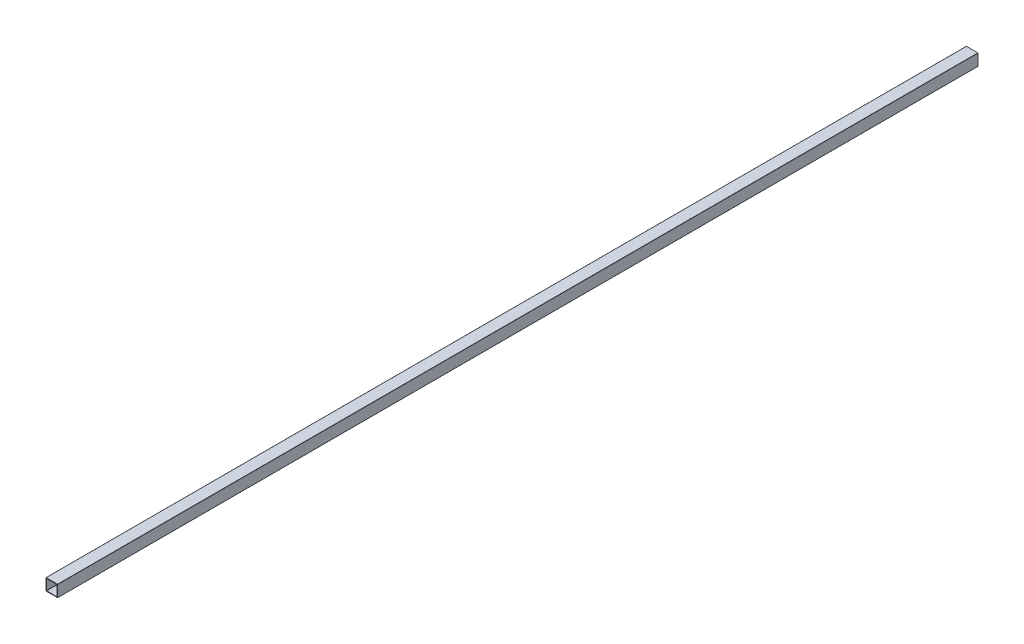
ISO-10303-21;
HEADER;
FILE_DESCRIPTION(('STEP AP214'),'2;1');
FILE_NAME('part.step','',(''),(''),'','','');
FILE_SCHEMA(('AUTOMOTIVE_DESIGN { 1 0 10303 214 1 1 1 1 }'));
ENDSEC;
DATA;
#1=APPLICATION_CONTEXT('core data for automotive mechanical design processes');
#2=APPLICATION_PROTOCOL_DEFINITION('international standard','automotive_design',2000,#1);
#3=PRODUCT_CONTEXT('',#1,'mechanical');
#4=PRODUCT('Part','Part','',(#3));
#5=PRODUCT_RELATED_PRODUCT_CATEGORY('part','',(#4));
#6=PRODUCT_DEFINITION_FORMATION('','',#4);
#7=PRODUCT_DEFINITION_CONTEXT('part definition',#1,'design');
#8=PRODUCT_DEFINITION('design','',#6,#7);
#9=PRODUCT_DEFINITION_SHAPE('','',#8);
#10=(LENGTH_UNIT() NAMED_UNIT(*) SI_UNIT(.MILLI.,.METRE.));
#11=(NAMED_UNIT(*) PLANE_ANGLE_UNIT() SI_UNIT($,.RADIAN.));
#12=(NAMED_UNIT(*) SI_UNIT($,.STERADIAN.) SOLID_ANGLE_UNIT());
#13=UNCERTAINTY_MEASURE_WITH_UNIT(LENGTH_MEASURE(1.E-05),#10,'distance_accuracy_value','');
#14=(GEOMETRIC_REPRESENTATION_CONTEXT(3) GLOBAL_UNCERTAINTY_ASSIGNED_CONTEXT((#13)) GLOBAL_UNIT_ASSIGNED_CONTEXT((#10,
#11,#12)) REPRESENTATION_CONTEXT('',''));
#15=CARTESIAN_POINT('',(0.,0.,0.));
#16=DIRECTION('',(0.,0.,1.));
#17=DIRECTION('',(1.,0.,0.));
#18=AXIS2_PLACEMENT_3D('',#15,#16,#17);
#19=CARTESIAN_POINT('',(38.1,-38.1,-6000.));
#20=DIRECTION('',(1.,0.,0.));
#21=DIRECTION('',(0.,0.,-1.));
#22=AXIS2_PLACEMENT_3D('',#19,#20,#21);
#23=PLANE('',#22);
#24=DIRECTION('',(0.,1.,0.));
#25=VECTOR('',#24,1.);
#26=CARTESIAN_POINT('',(38.1,-38.1,0.));
#27=LINE('',#26,#25);
#28=CARTESIAN_POINT('',(38.1,-37.1,0.));
#29=VERTEX_POINT('',#28);
#30=CARTESIAN_POINT('',(38.1,37.1,0.));
#31=VERTEX_POINT('',#30);
#32=EDGE_CURVE('E197',#29,#31,#27,.T.);
#33=ORIENTED_EDGE('',*,*,#32,.F.);
#34=DIRECTION('',(0.,0.,1.));
#35=VECTOR('',#34,1.);
#36=CARTESIAN_POINT('',(38.1,-37.1,-6000.));
#37=LINE('',#36,#35);
#38=CARTESIAN_POINT('',(38.1,-37.1,-6000.));
#39=VERTEX_POINT('',#38);
#40=EDGE_CURVE('E158',#29,#39,#37,.F.);
#41=ORIENTED_EDGE('',*,*,#40,.T.);
#42=DIRECTION('',(0.,1.,0.));
#43=VECTOR('',#42,1.);
#44=CARTESIAN_POINT('',(38.1,-38.1,-6000.));
#45=LINE('',#44,#43);
#46=CARTESIAN_POINT('',(38.1,37.1,-6000.));
#47=VERTEX_POINT('',#46);
#48=EDGE_CURVE('E185',#39,#47,#45,.T.);
#49=ORIENTED_EDGE('',*,*,#48,.T.);
#50=DIRECTION('',(0.,0.,1.));
#51=VECTOR('',#50,1.);
#52=CARTESIAN_POINT('',(38.1,37.1,-6000.));
#53=LINE('',#52,#51);
#54=EDGE_CURVE('E251',#47,#31,#53,.T.);
#55=ORIENTED_EDGE('',*,*,#54,.T.);
#56=EDGE_LOOP('',(#33,#41,#49,#55));
#57=FACE_BOUND('',#56,.T.);
#58=ADVANCED_FACE('F33',(#57),#23,.T.);
#59=CARTESIAN_POINT('',(-38.1,-38.1,-6000.));
#60=DIRECTION('',(0.,-1.,0.));
#61=DIRECTION('',(0.,0.,-1.));
#62=AXIS2_PLACEMENT_3D('',#59,#60,#61);
#63=PLANE('',#62);
#64=DIRECTION('',(1.,0.,0.));
#65=VECTOR('',#64,1.);
#66=CARTESIAN_POINT('',(-38.1,-38.1,0.));
#67=LINE('',#66,#65);
#68=CARTESIAN_POINT('',(-37.1,-38.1,0.));
#69=VERTEX_POINT('',#68);
#70=CARTESIAN_POINT('',(37.1,-38.1,0.));
#71=VERTEX_POINT('',#70);
#72=EDGE_CURVE('E189',#69,#71,#67,.T.);
#73=ORIENTED_EDGE('',*,*,#72,.F.);
#74=DIRECTION('',(0.,0.,1.));
#75=VECTOR('',#74,1.);
#76=CARTESIAN_POINT('',(-37.1,-38.1,-6000.));
#77=LINE('',#76,#75);
#78=CARTESIAN_POINT('',(-37.1,-38.1,-6000.));
#79=VERTEX_POINT('',#78);
#80=EDGE_CURVE('E238',#69,#79,#77,.F.);
#81=ORIENTED_EDGE('',*,*,#80,.T.);
#82=DIRECTION('',(1.,0.,0.));
#83=VECTOR('',#82,1.);
#84=CARTESIAN_POINT('',(-38.1,-38.1,-6000.));
#85=LINE('',#84,#83);
#86=CARTESIAN_POINT('',(37.1,-38.1,-6000.));
#87=VERTEX_POINT('',#86);
#88=EDGE_CURVE('E194',#79,#87,#85,.T.);
#89=ORIENTED_EDGE('',*,*,#88,.T.);
#90=DIRECTION('',(0.,0.,1.));
#91=VECTOR('',#90,1.);
#92=CARTESIAN_POINT('',(37.1,-38.1,-6000.));
#93=LINE('',#92,#91);
#94=EDGE_CURVE('E235',#87,#71,#93,.T.);
#95=ORIENTED_EDGE('',*,*,#94,.T.);
#96=EDGE_LOOP('',(#73,#81,#89,#95));
#97=FACE_BOUND('',#96,.T.);
#98=ADVANCED_FACE('F305',(#97),#63,.T.);
#99=CARTESIAN_POINT('',(-38.1,-38.1,-6000.));
#100=DIRECTION('',(-1.,0.,0.));
#101=DIRECTION('',(0.,0.,1.));
#102=AXIS2_PLACEMENT_3D('',#99,#100,#101);
#103=PLANE('',#102);
#104=DIRECTION('',(0.,-1.,0.));
#105=VECTOR('',#104,1.);
#106=CARTESIAN_POINT('',(-38.1,-38.1,-6000.));
#107=LINE('',#106,#105);
#108=CARTESIAN_POINT('',(-38.1,37.1,-6000.));
#109=VERTEX_POINT('',#108);
#110=CARTESIAN_POINT('',(-38.1,-37.1,-6000.));
#111=VERTEX_POINT('',#110);
#112=EDGE_CURVE('E191',#109,#111,#107,.T.);
#113=ORIENTED_EDGE('',*,*,#112,.T.);
#114=DIRECTION('',(0.,0.,1.));
#115=VECTOR('',#114,1.);
#116=CARTESIAN_POINT('',(-38.1,-37.1,-6000.));
#117=LINE('',#116,#115);
#118=CARTESIAN_POINT('',(-38.1,-37.1,0.));
#119=VERTEX_POINT('',#118);
#120=EDGE_CURVE('E224',#111,#119,#117,.T.);
#121=ORIENTED_EDGE('',*,*,#120,.T.);
#122=DIRECTION('',(0.,-1.,0.));
#123=VECTOR('',#122,1.);
#124=CARTESIAN_POINT('',(-38.1,-38.1,0.));
#125=LINE('',#124,#123);
#126=CARTESIAN_POINT('',(-38.1,37.1,0.));
#127=VERTEX_POINT('',#126);
#128=EDGE_CURVE('E203',#127,#119,#125,.T.);
#129=ORIENTED_EDGE('',*,*,#128,.F.);
#130=DIRECTION('',(0.,0.,1.));
#131=VECTOR('',#130,1.);
#132=CARTESIAN_POINT('',(-38.1,37.1,-6000.));
#133=LINE('',#132,#131);
#134=EDGE_CURVE('E222',#127,#109,#133,.F.);
#135=ORIENTED_EDGE('',*,*,#134,.T.);
#136=EDGE_LOOP('',(#113,#121,#129,#135));
#137=FACE_BOUND('',#136,.T.);
#138=ADVANCED_FACE('F311',(#137),#103,.T.);
#139=CARTESIAN_POINT('',(-38.1,38.1,-6000.));
#140=DIRECTION('',(0.,1.,0.));
#141=DIRECTION('',(0.,0.,1.));
#142=AXIS2_PLACEMENT_3D('',#139,#140,#141);
#143=PLANE('',#142);
#144=DIRECTION('',(-1.,0.,0.));
#145=VECTOR('',#144,1.);
#146=CARTESIAN_POINT('',(-38.1,38.1,-6000.));
#147=LINE('',#146,#145);
#148=CARTESIAN_POINT('',(37.1,38.1,-6000.));
#149=VERTEX_POINT('',#148);
#150=CARTESIAN_POINT('',(-37.1,38.1,-6000.));
#151=VERTEX_POINT('',#150);
#152=EDGE_CURVE('E188',#149,#151,#147,.T.);
#153=ORIENTED_EDGE('',*,*,#152,.T.);
#154=DIRECTION('',(0.,0.,1.));
#155=VECTOR('',#154,1.);
#156=CARTESIAN_POINT('',(-37.1,38.1,-6000.));
#157=LINE('',#156,#155);
#158=CARTESIAN_POINT('',(-37.1,38.1,0.));
#159=VERTEX_POINT('',#158);
#160=EDGE_CURVE('E248',#151,#159,#157,.T.);
#161=ORIENTED_EDGE('',*,*,#160,.T.);
#162=DIRECTION('',(-1.,0.,0.));
#163=VECTOR('',#162,1.);
#164=CARTESIAN_POINT('',(-38.1,38.1,0.));
#165=LINE('',#164,#163);
#166=CARTESIAN_POINT('',(37.1,38.1,0.));
#167=VERTEX_POINT('',#166);
#168=EDGE_CURVE('E200',#167,#159,#165,.T.);
#169=ORIENTED_EDGE('',*,*,#168,.F.);
#170=DIRECTION('',(0.,0.,1.));
#171=VECTOR('',#170,1.);
#172=CARTESIAN_POINT('',(37.1,38.1,-6000.));
#173=LINE('',#172,#171);
#174=EDGE_CURVE('E55',#167,#149,#173,.F.);
#175=ORIENTED_EDGE('',*,*,#174,.T.);
#176=EDGE_LOOP('',(#153,#161,#169,#175));
#177=FACE_BOUND('',#176,.T.);
#178=ADVANCED_FACE('F316',(#177),#143,.T.);
#179=CARTESIAN_POINT('',(0.,0.,-6000.));
#180=DIRECTION('',(0.,0.,-1.));
#181=DIRECTION('',(-1.,0.,0.));
#182=AXIS2_PLACEMENT_3D('',#179,#180,#181);
#183=PLANE('',#182);
#184=DIRECTION('',(0.,-1.,0.));
#185=VECTOR('',#184,1.);
#186=CARTESIAN_POINT('',(-34.6,-34.6,-6000.));
#187=LINE('',#186,#185);
#188=CARTESIAN_POINT('',(-34.6,33.6,-6000.));
#189=VERTEX_POINT('',#188);
#190=CARTESIAN_POINT('',(-34.6,-33.6,-6000.));
#191=VERTEX_POINT('',#190);
#192=EDGE_CURVE('E167',#189,#191,#187,.T.);
#193=ORIENTED_EDGE('',*,*,#192,.T.);
#194=CARTESIAN_POINT('',(-33.6,-33.6,-6000.));
#195=DIRECTION('',(0.,0.,-1.));
#196=DIRECTION('',(-1.,0.,0.));
#197=AXIS2_PLACEMENT_3D('',#194,#195,#196);
#198=CIRCLE('',#197,1.);
#199=CARTESIAN_POINT('',(-33.6,-34.6,-6000.));
#200=VERTEX_POINT('',#199);
#201=EDGE_CURVE('E11',#191,#200,#198,.F.);
#202=ORIENTED_EDGE('',*,*,#201,.T.);
#203=DIRECTION('',(1.,0.,0.));
#204=VECTOR('',#203,1.);
#205=CARTESIAN_POINT('',(-34.6,-34.6,-6000.));
#206=LINE('',#205,#204);
#207=CARTESIAN_POINT('',(33.6,-34.6,-6000.));
#208=VERTEX_POINT('',#207);
#209=EDGE_CURVE('E175',#200,#208,#206,.T.);
#210=ORIENTED_EDGE('',*,*,#209,.T.);
#211=CARTESIAN_POINT('',(33.6,-33.6,-6000.));
#212=DIRECTION('',(0.,0.,-1.));
#213=DIRECTION('',(-1.,0.,0.));
#214=AXIS2_PLACEMENT_3D('',#211,#212,#213);
#215=CIRCLE('',#214,1.);
#216=CARTESIAN_POINT('',(34.6,-33.6,-6000.));
#217=VERTEX_POINT('',#216);
#218=EDGE_CURVE('E262',#208,#217,#215,.F.);
#219=ORIENTED_EDGE('',*,*,#218,.T.);
#220=DIRECTION('',(0.,1.,0.));
#221=VECTOR('',#220,1.);
#222=CARTESIAN_POINT('',(34.6,-34.6,-6000.));
#223=LINE('',#222,#221);
#224=CARTESIAN_POINT('',(34.6,33.6,-6000.));
#225=VERTEX_POINT('',#224);
#226=EDGE_CURVE('E179',#217,#225,#223,.T.);
#227=ORIENTED_EDGE('',*,*,#226,.T.);
#228=CARTESIAN_POINT('',(33.6,33.6,-6000.));
#229=DIRECTION('',(0.,0.,-1.));
#230=DIRECTION('',(-1.,0.,0.));
#231=AXIS2_PLACEMENT_3D('',#228,#229,#230);
#232=CIRCLE('',#231,1.);
#233=CARTESIAN_POINT('',(33.6,34.6,-6000.));
#234=VERTEX_POINT('',#233);
#235=EDGE_CURVE('E258',#225,#234,#232,.F.);
#236=ORIENTED_EDGE('',*,*,#235,.T.);
#237=DIRECTION('',(-1.,0.,0.));
#238=VECTOR('',#237,1.);
#239=CARTESIAN_POINT('',(-34.6,34.6,-6000.));
#240=LINE('',#239,#238);
#241=CARTESIAN_POINT('',(-33.6,34.6,-6000.));
#242=VERTEX_POINT('',#241);
#243=EDGE_CURVE('E277',#234,#242,#240,.T.);
#244=ORIENTED_EDGE('',*,*,#243,.T.);
#245=CARTESIAN_POINT('',(-33.6,33.6,-6000.));
#246=DIRECTION('',(0.,0.,-1.));
#247=DIRECTION('',(-1.,0.,0.));
#248=AXIS2_PLACEMENT_3D('',#245,#246,#247);
#249=CIRCLE('',#248,1.);
#250=EDGE_CURVE('E157',#242,#189,#249,.F.);
#251=ORIENTED_EDGE('',*,*,#250,.T.);
#252=EDGE_LOOP('',(#193,#202,#210,#219,#227,#236,#244,#251));
#253=FACE_BOUND('',#252,.T.);
#254=ORIENTED_EDGE('',*,*,#88,.F.);
#255=CARTESIAN_POINT('',(-37.1,-37.1,-6000.));
#256=DIRECTION('',(0.,0.,-1.));
#257=DIRECTION('',(-1.,0.,0.));
#258=AXIS2_PLACEMENT_3D('',#255,#256,#257);
#259=CIRCLE('',#258,1.);
#260=EDGE_CURVE('E245',#79,#111,#259,.T.);
#261=ORIENTED_EDGE('',*,*,#260,.T.);
#262=ORIENTED_EDGE('',*,*,#112,.F.);
#263=CARTESIAN_POINT('',(-37.1,37.1,-6000.));
#264=DIRECTION('',(0.,0.,-1.));
#265=DIRECTION('',(-1.,0.,0.));
#266=AXIS2_PLACEMENT_3D('',#263,#264,#265);
#267=CIRCLE('',#266,1.);
#268=EDGE_CURVE('E48',#109,#151,#267,.T.);
#269=ORIENTED_EDGE('',*,*,#268,.T.);
#270=ORIENTED_EDGE('',*,*,#152,.F.);
#271=CARTESIAN_POINT('',(37.1,37.1,-6000.));
#272=DIRECTION('',(0.,0.,-1.));
#273=DIRECTION('',(-1.,0.,0.));
#274=AXIS2_PLACEMENT_3D('',#271,#272,#273);
#275=CIRCLE('',#274,1.);
#276=EDGE_CURVE('E240',#149,#47,#275,.T.);
#277=ORIENTED_EDGE('',*,*,#276,.T.);
#278=ORIENTED_EDGE('',*,*,#48,.F.);
#279=CARTESIAN_POINT('',(37.1,-37.1,-6000.));
#280=DIRECTION('',(0.,0.,-1.));
#281=DIRECTION('',(-1.,0.,0.));
#282=AXIS2_PLACEMENT_3D('',#279,#280,#281);
#283=CIRCLE('',#282,1.);
#284=EDGE_CURVE('E242',#39,#87,#283,.T.);
#285=ORIENTED_EDGE('',*,*,#284,.T.);
#286=EDGE_LOOP('',(#254,#261,#262,#269,#270,#277,#278,#285));
#287=FACE_BOUND('',#286,.T.);
#288=ADVANCED_FACE('F267',(#253,#287),#183,.T.);
#289=CARTESIAN_POINT('',(0.,0.,0.));
#290=DIRECTION('',(0.,0.,-1.));
#291=DIRECTION('',(-1.,0.,0.));
#292=AXIS2_PLACEMENT_3D('',#289,#290,#291);
#293=PLANE('',#292);
#294=DIRECTION('',(0.,1.,0.));
#295=VECTOR('',#294,1.);
#296=CARTESIAN_POINT('',(34.6,-34.6,0.));
#297=LINE('',#296,#295);
#298=CARTESIAN_POINT('',(34.6,-33.6,0.));
#299=VERTEX_POINT('',#298);
#300=CARTESIAN_POINT('',(34.6,33.6,0.));
#301=VERTEX_POINT('',#300);
#302=EDGE_CURVE('E181',#299,#301,#297,.T.);
#303=ORIENTED_EDGE('',*,*,#302,.F.);
#304=CARTESIAN_POINT('',(33.6,-33.6,0.));
#305=DIRECTION('',(0.,0.,-1.));
#306=DIRECTION('',(-1.,0.,0.));
#307=AXIS2_PLACEMENT_3D('',#304,#305,#306);
#308=CIRCLE('',#307,1.);
#309=CARTESIAN_POINT('',(33.6,-34.6,0.));
#310=VERTEX_POINT('',#309);
#311=EDGE_CURVE('E260',#299,#310,#308,.T.);
#312=ORIENTED_EDGE('',*,*,#311,.T.);
#313=DIRECTION('',(1.,0.,0.));
#314=VECTOR('',#313,1.);
#315=CARTESIAN_POINT('',(-34.6,-34.6,0.));
#316=LINE('',#315,#314);
#317=CARTESIAN_POINT('',(-33.6,-34.6,0.));
#318=VERTEX_POINT('',#317);
#319=EDGE_CURVE('E281',#318,#310,#316,.T.);
#320=ORIENTED_EDGE('',*,*,#319,.F.);
#321=CARTESIAN_POINT('',(-33.6,-33.6,0.));
#322=DIRECTION('',(0.,0.,-1.));
#323=DIRECTION('',(-1.,0.,0.));
#324=AXIS2_PLACEMENT_3D('',#321,#322,#323);
#325=CIRCLE('',#324,1.);
#326=CARTESIAN_POINT('',(-34.6,-33.6,0.));
#327=VERTEX_POINT('',#326);
#328=EDGE_CURVE('E41',#318,#327,#325,.T.);
#329=ORIENTED_EDGE('',*,*,#328,.T.);
#330=DIRECTION('',(0.,-1.,0.));
#331=VECTOR('',#330,1.);
#332=CARTESIAN_POINT('',(-34.6,-34.6,0.));
#333=LINE('',#332,#331);
#334=CARTESIAN_POINT('',(-34.6,33.6,0.));
#335=VERTEX_POINT('',#334);
#336=EDGE_CURVE('E164',#335,#327,#333,.T.);
#337=ORIENTED_EDGE('',*,*,#336,.F.);
#338=CARTESIAN_POINT('',(-33.6,33.6,0.));
#339=DIRECTION('',(0.,0.,-1.));
#340=DIRECTION('',(-1.,0.,0.));
#341=AXIS2_PLACEMENT_3D('',#338,#339,#340);
#342=CIRCLE('',#341,1.);
#343=CARTESIAN_POINT('',(-33.6,34.6,0.));
#344=VERTEX_POINT('',#343);
#345=EDGE_CURVE('E147',#335,#344,#342,.T.);
#346=ORIENTED_EDGE('',*,*,#345,.T.);
#347=DIRECTION('',(-1.,0.,0.));
#348=VECTOR('',#347,1.);
#349=CARTESIAN_POINT('',(-34.6,34.6,0.));
#350=LINE('',#349,#348);
#351=CARTESIAN_POINT('',(33.6,34.6,0.));
#352=VERTEX_POINT('',#351);
#353=EDGE_CURVE('E176',#352,#344,#350,.T.);
#354=ORIENTED_EDGE('',*,*,#353,.F.);
#355=CARTESIAN_POINT('',(33.6,33.6,0.));
#356=DIRECTION('',(0.,0.,-1.));
#357=DIRECTION('',(-1.,0.,0.));
#358=AXIS2_PLACEMENT_3D('',#355,#356,#357);
#359=CIRCLE('',#358,1.);
#360=EDGE_CURVE('E256',#352,#301,#359,.T.);
#361=ORIENTED_EDGE('',*,*,#360,.T.);
#362=EDGE_LOOP('',(#303,#312,#320,#329,#337,#346,#354,#361));
#363=FACE_BOUND('',#362,.T.);
#364=ORIENTED_EDGE('',*,*,#128,.T.);
#365=CARTESIAN_POINT('',(-37.1,-37.1,0.));
#366=DIRECTION('',(0.,0.,-1.));
#367=DIRECTION('',(-1.,0.,0.));
#368=AXIS2_PLACEMENT_3D('',#365,#366,#367);
#369=CIRCLE('',#368,1.);
#370=EDGE_CURVE('E233',#119,#69,#369,.F.);
#371=ORIENTED_EDGE('',*,*,#370,.T.);
#372=ORIENTED_EDGE('',*,*,#72,.T.);
#373=CARTESIAN_POINT('',(37.1,-37.1,0.));
#374=DIRECTION('',(0.,0.,-1.));
#375=DIRECTION('',(-1.,0.,0.));
#376=AXIS2_PLACEMENT_3D('',#373,#374,#375);
#377=CIRCLE('',#376,1.);
#378=EDGE_CURVE('E229',#71,#29,#377,.F.);
#379=ORIENTED_EDGE('',*,*,#378,.T.);
#380=ORIENTED_EDGE('',*,*,#32,.T.);
#381=CARTESIAN_POINT('',(37.1,37.1,0.));
#382=DIRECTION('',(0.,0.,-1.));
#383=DIRECTION('',(-1.,0.,0.));
#384=AXIS2_PLACEMENT_3D('',#381,#382,#383);
#385=CIRCLE('',#384,1.);
#386=EDGE_CURVE('E227',#31,#167,#385,.F.);
#387=ORIENTED_EDGE('',*,*,#386,.T.);
#388=ORIENTED_EDGE('',*,*,#168,.T.);
#389=CARTESIAN_POINT('',(-37.1,37.1,0.));
#390=DIRECTION('',(0.,0.,-1.));
#391=DIRECTION('',(-1.,0.,0.));
#392=AXIS2_PLACEMENT_3D('',#389,#390,#391);
#393=CIRCLE('',#392,1.);
#394=EDGE_CURVE('E231',#159,#127,#393,.F.);
#395=ORIENTED_EDGE('',*,*,#394,.T.);
#396=EDGE_LOOP('',(#364,#371,#372,#379,#380,#387,#388,#395));
#397=FACE_BOUND('',#396,.T.);
#398=ADVANCED_FACE('F172',(#363,#397),#293,.F.);
#399=CARTESIAN_POINT('',(-34.6,-34.6,-6000.));
#400=DIRECTION('',(0.,-1.,0.));
#401=DIRECTION('',(0.,0.,-1.));
#402=AXIS2_PLACEMENT_3D('',#399,#400,#401);
#403=PLANE('',#402);
#404=ORIENTED_EDGE('',*,*,#319,.T.);
#405=DIRECTION('',(0.,0.,1.));
#406=VECTOR('',#405,1.);
#407=CARTESIAN_POINT('',(33.6,-34.6,-6000.));
#408=LINE('',#407,#406);
#409=EDGE_CURVE('E220',#310,#208,#408,.F.);
#410=ORIENTED_EDGE('',*,*,#409,.T.);
#411=ORIENTED_EDGE('',*,*,#209,.F.);
#412=DIRECTION('',(0.,0.,1.));
#413=VECTOR('',#412,1.);
#414=CARTESIAN_POINT('',(-33.6,-34.6,0.));
#415=LINE('',#414,#413);
#416=EDGE_CURVE('E217',#200,#318,#415,.T.);
#417=ORIENTED_EDGE('',*,*,#416,.T.);
#418=EDGE_LOOP('',(#404,#410,#411,#417));
#419=FACE_BOUND('',#418,.T.);
#420=ADVANCED_FACE('F283',(#419),#403,.F.);
#421=CARTESIAN_POINT('',(-34.6,-34.6,-6000.));
#422=DIRECTION('',(-1.,0.,0.));
#423=DIRECTION('',(0.,0.,1.));
#424=AXIS2_PLACEMENT_3D('',#421,#422,#423);
#425=PLANE('',#424);
#426=ORIENTED_EDGE('',*,*,#192,.F.);
#427=DIRECTION('',(0.,0.,1.));
#428=VECTOR('',#427,1.);
#429=CARTESIAN_POINT('',(-34.6,33.6,0.));
#430=LINE('',#429,#428);
#431=EDGE_CURVE('E151',#189,#335,#430,.T.);
#432=ORIENTED_EDGE('',*,*,#431,.T.);
#433=ORIENTED_EDGE('',*,*,#336,.T.);
#434=DIRECTION('',(0.,0.,1.));
#435=VECTOR('',#434,1.);
#436=CARTESIAN_POINT('',(-34.6,-33.6,-6000.));
#437=LINE('',#436,#435);
#438=EDGE_CURVE('E169',#327,#191,#437,.F.);
#439=ORIENTED_EDGE('',*,*,#438,.T.);
#440=EDGE_LOOP('',(#426,#432,#433,#439));
#441=FACE_BOUND('',#440,.T.);
#442=ADVANCED_FACE('F163',(#441),#425,.F.);
#443=CARTESIAN_POINT('',(-34.6,34.6,-6000.));
#444=DIRECTION('',(0.,1.,0.));
#445=DIRECTION('',(0.,0.,1.));
#446=AXIS2_PLACEMENT_3D('',#443,#444,#445);
#447=PLANE('',#446);
#448=ORIENTED_EDGE('',*,*,#353,.T.);
#449=DIRECTION('',(0.,0.,1.));
#450=VECTOR('',#449,1.);
#451=CARTESIAN_POINT('',(-33.6,34.6,-6000.));
#452=LINE('',#451,#450);
#453=EDGE_CURVE('E152',#344,#242,#452,.F.);
#454=ORIENTED_EDGE('',*,*,#453,.T.);
#455=ORIENTED_EDGE('',*,*,#243,.F.);
#456=DIRECTION('',(0.,0.,1.));
#457=VECTOR('',#456,1.);
#458=CARTESIAN_POINT('',(33.6,34.6,0.));
#459=LINE('',#458,#457);
#460=EDGE_CURVE('E168',#234,#352,#459,.T.);
#461=ORIENTED_EDGE('',*,*,#460,.T.);
#462=EDGE_LOOP('',(#448,#454,#455,#461));
#463=FACE_BOUND('',#462,.T.);
#464=ADVANCED_FACE('F292',(#463),#447,.F.);
#465=CARTESIAN_POINT('',(34.6,-34.6,-6000.));
#466=DIRECTION('',(1.,0.,0.));
#467=DIRECTION('',(0.,0.,-1.));
#468=AXIS2_PLACEMENT_3D('',#465,#466,#467);
#469=PLANE('',#468);
#470=ORIENTED_EDGE('',*,*,#302,.T.);
#471=DIRECTION('',(0.,0.,1.));
#472=VECTOR('',#471,1.);
#473=CARTESIAN_POINT('',(34.6,33.6,-6000.));
#474=LINE('',#473,#472);
#475=EDGE_CURVE('E215',#301,#225,#474,.F.);
#476=ORIENTED_EDGE('',*,*,#475,.T.);
#477=ORIENTED_EDGE('',*,*,#226,.F.);
#478=DIRECTION('',(0.,0.,1.));
#479=VECTOR('',#478,1.);
#480=CARTESIAN_POINT('',(34.6,-33.6,0.));
#481=LINE('',#480,#479);
#482=EDGE_CURVE('E212',#217,#299,#481,.T.);
#483=ORIENTED_EDGE('',*,*,#482,.T.);
#484=EDGE_LOOP('',(#470,#476,#477,#483));
#485=FACE_BOUND('',#484,.T.);
#486=ADVANCED_FACE('F275',(#485),#469,.F.);
#487=CARTESIAN_POINT('',(-33.6,33.6,-6000.));
#488=DIRECTION('',(0.,0.,-1.));
#489=DIRECTION('',(-1.,0.,0.));
#490=AXIS2_PLACEMENT_3D('',#487,#488,#489);
#491=CYLINDRICAL_SURFACE('',#490,1.);
#492=ORIENTED_EDGE('',*,*,#250,.F.);
#493=ORIENTED_EDGE('',*,*,#453,.F.);
#494=ORIENTED_EDGE('',*,*,#345,.F.);
#495=ORIENTED_EDGE('',*,*,#431,.F.);
#496=EDGE_LOOP('',(#492,#493,#494,#495));
#497=FACE_BOUND('',#496,.T.);
#498=ADVANCED_FACE('F150',(#497),#491,.F.);
#499=CARTESIAN_POINT('',(33.6,33.6,-6000.));
#500=DIRECTION('',(0.,0.,-1.));
#501=DIRECTION('',(-1.,0.,0.));
#502=AXIS2_PLACEMENT_3D('',#499,#500,#501);
#503=CYLINDRICAL_SURFACE('',#502,1.);
#504=ORIENTED_EDGE('',*,*,#235,.F.);
#505=ORIENTED_EDGE('',*,*,#475,.F.);
#506=ORIENTED_EDGE('',*,*,#360,.F.);
#507=ORIENTED_EDGE('',*,*,#460,.F.);
#508=EDGE_LOOP('',(#504,#505,#506,#507));
#509=FACE_BOUND('',#508,.T.);
#510=ADVANCED_FACE('F294',(#509),#503,.F.);
#511=CARTESIAN_POINT('',(33.6,-33.6,-6000.));
#512=DIRECTION('',(0.,0.,-1.));
#513=DIRECTION('',(-1.,0.,0.));
#514=AXIS2_PLACEMENT_3D('',#511,#512,#513);
#515=CYLINDRICAL_SURFACE('',#514,1.);
#516=ORIENTED_EDGE('',*,*,#218,.F.);
#517=ORIENTED_EDGE('',*,*,#409,.F.);
#518=ORIENTED_EDGE('',*,*,#311,.F.);
#519=ORIENTED_EDGE('',*,*,#482,.F.);
#520=EDGE_LOOP('',(#516,#517,#518,#519));
#521=FACE_BOUND('',#520,.T.);
#522=ADVANCED_FACE('F279',(#521),#515,.F.);
#523=CARTESIAN_POINT('',(-37.1,-37.1,-6000.));
#524=DIRECTION('',(0.,0.,1.));
#525=DIRECTION('',(1.,0.,0.));
#526=AXIS2_PLACEMENT_3D('',#523,#524,#525);
#527=CYLINDRICAL_SURFACE('',#526,1.);
#528=ORIENTED_EDGE('',*,*,#260,.F.);
#529=ORIENTED_EDGE('',*,*,#80,.F.);
#530=ORIENTED_EDGE('',*,*,#370,.F.);
#531=ORIENTED_EDGE('',*,*,#120,.F.);
#532=EDGE_LOOP('',(#528,#529,#530,#531));
#533=FACE_BOUND('',#532,.T.);
#534=ADVANCED_FACE('F301',(#533),#527,.T.);
#535=CARTESIAN_POINT('',(-37.1,37.1,-6000.));
#536=DIRECTION('',(0.,0.,1.));
#537=DIRECTION('',(1.,0.,0.));
#538=AXIS2_PLACEMENT_3D('',#535,#536,#537);
#539=CYLINDRICAL_SURFACE('',#538,1.);
#540=ORIENTED_EDGE('',*,*,#268,.F.);
#541=ORIENTED_EDGE('',*,*,#134,.F.);
#542=ORIENTED_EDGE('',*,*,#394,.F.);
#543=ORIENTED_EDGE('',*,*,#160,.F.);
#544=EDGE_LOOP('',(#540,#541,#542,#543));
#545=FACE_BOUND('',#544,.T.);
#546=ADVANCED_FACE('F368',(#545),#539,.T.);
#547=CARTESIAN_POINT('',(-33.6,-33.6,-6000.));
#548=DIRECTION('',(0.,0.,-1.));
#549=DIRECTION('',(-1.,0.,0.));
#550=AXIS2_PLACEMENT_3D('',#547,#548,#549);
#551=CYLINDRICAL_SURFACE('',#550,1.);
#552=ORIENTED_EDGE('',*,*,#201,.F.);
#553=ORIENTED_EDGE('',*,*,#438,.F.);
#554=ORIENTED_EDGE('',*,*,#328,.F.);
#555=ORIENTED_EDGE('',*,*,#416,.F.);
#556=EDGE_LOOP('',(#552,#553,#554,#555));
#557=FACE_BOUND('',#556,.T.);
#558=ADVANCED_FACE('F378',(#557),#551,.F.);
#559=CARTESIAN_POINT('',(37.1,-37.1,-6000.));
#560=DIRECTION('',(0.,0.,1.));
#561=DIRECTION('',(1.,0.,0.));
#562=AXIS2_PLACEMENT_3D('',#559,#560,#561);
#563=CYLINDRICAL_SURFACE('',#562,1.);
#564=ORIENTED_EDGE('',*,*,#284,.F.);
#565=ORIENTED_EDGE('',*,*,#40,.F.);
#566=ORIENTED_EDGE('',*,*,#378,.F.);
#567=ORIENTED_EDGE('',*,*,#94,.F.);
#568=EDGE_LOOP('',(#564,#565,#566,#567));
#569=FACE_BOUND('',#568,.T.);
#570=ADVANCED_FACE('F388',(#569),#563,.T.);
#571=CARTESIAN_POINT('',(37.1,37.1,-6000.));
#572=DIRECTION('',(0.,0.,1.));
#573=DIRECTION('',(1.,0.,0.));
#574=AXIS2_PLACEMENT_3D('',#571,#572,#573);
#575=CYLINDRICAL_SURFACE('',#574,1.);
#576=ORIENTED_EDGE('',*,*,#276,.F.);
#577=ORIENTED_EDGE('',*,*,#174,.F.);
#578=ORIENTED_EDGE('',*,*,#386,.F.);
#579=ORIENTED_EDGE('',*,*,#54,.F.);
#580=EDGE_LOOP('',(#576,#577,#578,#579));
#581=FACE_BOUND('',#580,.T.);
#582=ADVANCED_FACE('F35',(#581),#575,.T.);
#583=CLOSED_SHELL('',(#58,#98,#138,#178,#288,#398,#420,#442,#464,#486,#498,#510,#522,#534,#546,
#558,#570,#582));
#584=MANIFOLD_SOLID_BREP('B2',#583);
#585=ADVANCED_BREP_SHAPE_REPRESENTATION('',(#18,#584),#14);
#586=SHAPE_DEFINITION_REPRESENTATION(#9,#585);
ENDSEC;
END-ISO-10303-21;
